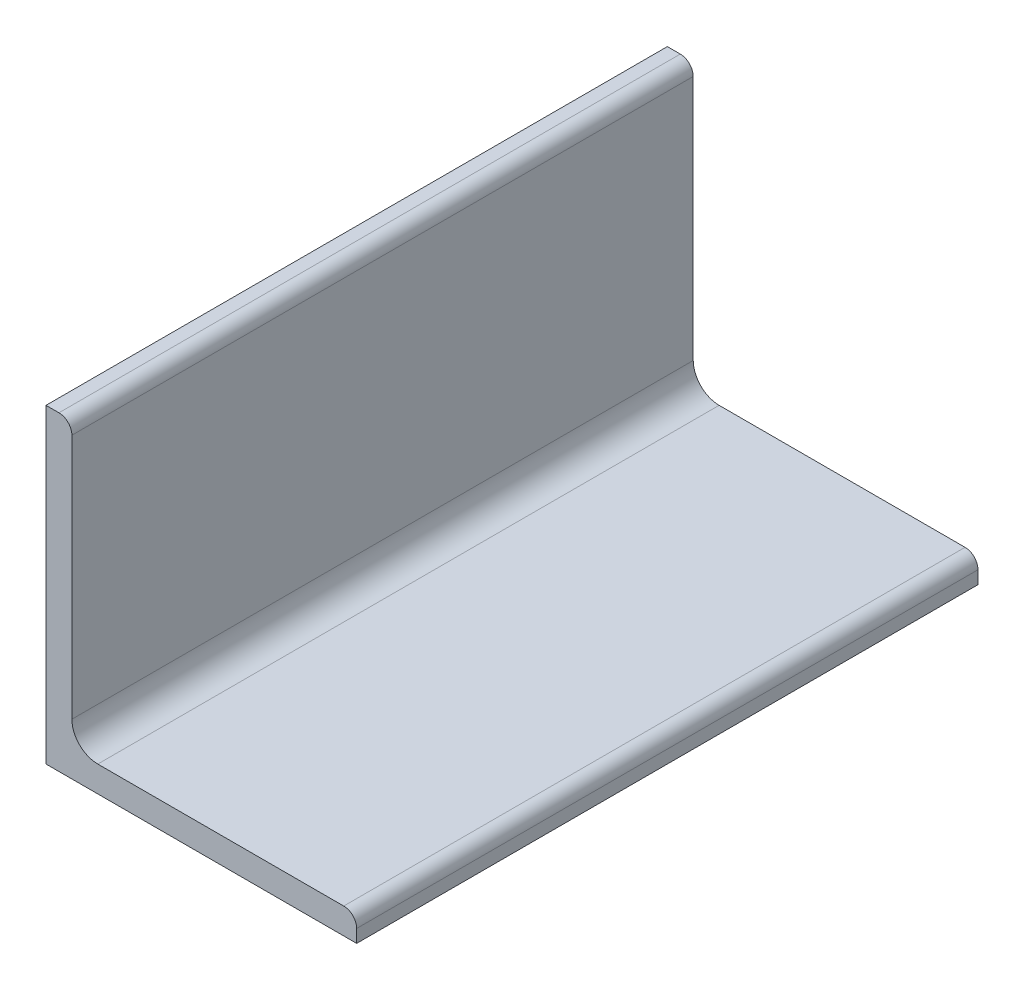
ISO-10303-21;
HEADER;
FILE_DESCRIPTION(('STEP AP214'),'2;1');
FILE_NAME('part.step','',(''),(''),'','','');
FILE_SCHEMA(('AUTOMOTIVE_DESIGN { 1 0 10303 214 1 1 1 1 }'));
ENDSEC;
DATA;
#1=APPLICATION_CONTEXT('core data for automotive mechanical design processes');
#2=APPLICATION_PROTOCOL_DEFINITION('international standard','automotive_design',2000,#1);
#3=PRODUCT_CONTEXT('',#1,'mechanical');
#4=PRODUCT('Part','Part','',(#3));
#5=PRODUCT_RELATED_PRODUCT_CATEGORY('part','',(#4));
#6=PRODUCT_DEFINITION_FORMATION('','',#4);
#7=PRODUCT_DEFINITION_CONTEXT('part definition',#1,'design');
#8=PRODUCT_DEFINITION('design','',#6,#7);
#9=PRODUCT_DEFINITION_SHAPE('','',#8);
#10=(LENGTH_UNIT() NAMED_UNIT(*) SI_UNIT(.MILLI.,.METRE.));
#11=(NAMED_UNIT(*) PLANE_ANGLE_UNIT() SI_UNIT($,.RADIAN.));
#12=(NAMED_UNIT(*) SI_UNIT($,.STERADIAN.) SOLID_ANGLE_UNIT());
#13=UNCERTAINTY_MEASURE_WITH_UNIT(LENGTH_MEASURE(1.E-05),#10,'distance_accuracy_value','');
#14=(GEOMETRIC_REPRESENTATION_CONTEXT(3) GLOBAL_UNCERTAINTY_ASSIGNED_CONTEXT((#13)) GLOBAL_UNIT_ASSIGNED_CONTEXT((#10,
#11,#12)) REPRESENTATION_CONTEXT('',''));
#15=CARTESIAN_POINT('',(0.,0.,0.));
#16=DIRECTION('',(0.,0.,1.));
#17=DIRECTION('',(1.,0.,0.));
#18=AXIS2_PLACEMENT_3D('',#15,#16,#17);
#19=CARTESIAN_POINT('',(0.425014111727251,152.925428131371,304.8));
#20=DIRECTION('',(1.,0.,0.));
#21=DIRECTION('',(0.,0.,-1.));
#22=AXIS2_PLACEMENT_3D('',#19,#20,#21);
#23=PLANE('',#22);
#24=DIRECTION('',(0.,-1.,0.));
#25=VECTOR('',#24,1.);
#26=CARTESIAN_POINT('',(0.425014111727251,152.925428131371,0.));
#27=LINE('',#26,#25);
#28=CARTESIAN_POINT('',(0.425014111727251,152.925428131371,0.));
#29=VERTEX_POINT('',#28);
#30=CARTESIAN_POINT('',(0.425014111727251,0.525428131371291,0.));
#31=VERTEX_POINT('',#30);
#32=EDGE_CURVE('E135',#29,#31,#27,.T.);
#33=ORIENTED_EDGE('',*,*,#32,.T.);
#34=DIRECTION('',(0.,0.,-1.));
#35=VECTOR('',#34,1.);
#36=CARTESIAN_POINT('',(0.425014111727251,0.525428131371291,304.8));
#37=LINE('',#36,#35);
#38=CARTESIAN_POINT('',(0.425014111727251,0.525428131371291,304.8));
#39=VERTEX_POINT('',#38);
#40=EDGE_CURVE('E11',#39,#31,#37,.T.);
#41=ORIENTED_EDGE('',*,*,#40,.F.);
#42=DIRECTION('',(0.,-1.,0.));
#43=VECTOR('',#42,1.);
#44=CARTESIAN_POINT('',(0.425014111727251,152.925428131371,304.8));
#45=LINE('',#44,#43);
#46=CARTESIAN_POINT('',(0.425014111727251,152.925428131371,304.8));
#47=VERTEX_POINT('',#46);
#48=EDGE_CURVE('E151',#47,#39,#45,.T.);
#49=ORIENTED_EDGE('',*,*,#48,.F.);
#50=DIRECTION('',(0.,0.,-1.));
#51=VECTOR('',#50,1.);
#52=CARTESIAN_POINT('',(0.425014111727251,152.925428131371,304.8));
#53=LINE('',#52,#51);
#54=EDGE_CURVE('E131',#47,#29,#53,.T.);
#55=ORIENTED_EDGE('',*,*,#54,.T.);
#56=EDGE_LOOP('',(#33,#41,#49,#55));
#57=FACE_BOUND('',#56,.T.);
#58=ADVANCED_FACE('F33',(#57),#23,.F.);
#59=CARTESIAN_POINT('',(0.425014111727251,0.525428131371291,304.8));
#60=DIRECTION('',(0.,1.,0.));
#61=DIRECTION('',(0.,0.,1.));
#62=AXIS2_PLACEMENT_3D('',#59,#60,#61);
#63=PLANE('',#62);
#64=DIRECTION('',(1.,0.,0.));
#65=VECTOR('',#64,1.);
#66=CARTESIAN_POINT('',(0.425014111727251,0.525428131371291,0.));
#67=LINE('',#66,#65);
#68=CARTESIAN_POINT('',(152.825014111727,0.525428131371291,0.));
#69=VERTEX_POINT('',#68);
#70=EDGE_CURVE('E138',#31,#69,#67,.T.);
#71=ORIENTED_EDGE('',*,*,#70,.T.);
#72=DIRECTION('',(0.,0.,-1.));
#73=VECTOR('',#72,1.);
#74=CARTESIAN_POINT('',(152.825014111727,0.525428131371291,304.8));
#75=LINE('',#74,#73);
#76=CARTESIAN_POINT('',(152.825014111727,0.525428131371291,304.8));
#77=VERTEX_POINT('',#76);
#78=EDGE_CURVE('E41',#77,#69,#75,.T.);
#79=ORIENTED_EDGE('',*,*,#78,.F.);
#80=DIRECTION('',(1.,0.,0.));
#81=VECTOR('',#80,1.);
#82=CARTESIAN_POINT('',(0.425014111727251,0.525428131371291,304.8));
#83=LINE('',#82,#81);
#84=EDGE_CURVE('E95',#39,#77,#83,.T.);
#85=ORIENTED_EDGE('',*,*,#84,.F.);
#86=ORIENTED_EDGE('',*,*,#40,.T.);
#87=EDGE_LOOP('',(#71,#79,#85,#86));
#88=FACE_BOUND('',#87,.T.);
#89=ADVANCED_FACE('F194',(#88),#63,.F.);
#90=CARTESIAN_POINT('',(152.825014111727,0.525428131371291,304.8));
#91=DIRECTION('',(-1.,0.,0.));
#92=DIRECTION('',(0.,0.,1.));
#93=AXIS2_PLACEMENT_3D('',#90,#91,#92);
#94=PLANE('',#93);
#95=DIRECTION('',(0.,1.,0.));
#96=VECTOR('',#95,1.);
#97=CARTESIAN_POINT('',(152.825014111727,0.525428131371291,0.));
#98=LINE('',#97,#96);
#99=CARTESIAN_POINT('',(152.825014111727,6.87542813137129,0.));
#100=VERTEX_POINT('',#99);
#101=EDGE_CURVE('E140',#69,#100,#98,.T.);
#102=ORIENTED_EDGE('',*,*,#101,.T.);
#103=DIRECTION('',(0.,0.,-1.));
#104=VECTOR('',#103,1.);
#105=CARTESIAN_POINT('',(152.825014111727,6.87542813137129,304.8));
#106=LINE('',#105,#104);
#107=CARTESIAN_POINT('',(152.825014111727,6.87542813137129,304.8));
#108=VERTEX_POINT('',#107);
#109=EDGE_CURVE('E161',#108,#100,#106,.T.);
#110=ORIENTED_EDGE('',*,*,#109,.F.);
#111=DIRECTION('',(0.,1.,0.));
#112=VECTOR('',#111,1.);
#113=CARTESIAN_POINT('',(152.825014111727,0.525428131371291,304.8));
#114=LINE('',#113,#112);
#115=EDGE_CURVE('E169',#77,#108,#114,.T.);
#116=ORIENTED_EDGE('',*,*,#115,.F.);
#117=ORIENTED_EDGE('',*,*,#78,.T.);
#118=EDGE_LOOP('',(#102,#110,#116,#117));
#119=FACE_BOUND('',#118,.T.);
#120=ADVANCED_FACE('F167',(#119),#94,.F.);
#121=CARTESIAN_POINT('',(146.475014111727,6.87542813137129,304.8));
#122=DIRECTION('',(0.,0.,-1.));
#123=DIRECTION('',(-1.,0.,0.));
#124=AXIS2_PLACEMENT_3D('',#121,#122,#123);
#125=CYLINDRICAL_SURFACE('',#124,6.35);
#126=CARTESIAN_POINT('',(146.475014111727,6.87542813137129,0.));
#127=DIRECTION('',(0.,0.,1.));
#128=DIRECTION('',(1.,0.,0.));
#129=AXIS2_PLACEMENT_3D('',#126,#127,#128);
#130=CIRCLE('',#129,6.35);
#131=CARTESIAN_POINT('',(146.475014111727,13.2254281313713,0.));
#132=VERTEX_POINT('',#131);
#133=EDGE_CURVE('E142',#100,#132,#130,.T.);
#134=ORIENTED_EDGE('',*,*,#133,.T.);
#135=DIRECTION('',(0.,0.,-1.));
#136=VECTOR('',#135,1.);
#137=CARTESIAN_POINT('',(146.475014111727,13.2254281313713,304.8));
#138=LINE('',#137,#136);
#139=CARTESIAN_POINT('',(146.475014111727,13.2254281313713,304.8));
#140=VERTEX_POINT('',#139);
#141=EDGE_CURVE('E158',#140,#132,#138,.T.);
#142=ORIENTED_EDGE('',*,*,#141,.F.);
#143=CARTESIAN_POINT('',(146.475014111727,6.87542813137129,304.8));
#144=DIRECTION('',(0.,0.,1.));
#145=DIRECTION('',(1.,0.,0.));
#146=AXIS2_PLACEMENT_3D('',#143,#144,#145);
#147=CIRCLE('',#146,6.35);
#148=EDGE_CURVE('E185',#108,#140,#147,.T.);
#149=ORIENTED_EDGE('',*,*,#148,.F.);
#150=ORIENTED_EDGE('',*,*,#109,.T.);
#151=EDGE_LOOP('',(#134,#142,#149,#150));
#152=FACE_BOUND('',#151,.T.);
#153=ADVANCED_FACE('F178',(#152),#125,.T.);
#154=CARTESIAN_POINT('',(146.475014111727,13.2254281313713,304.8));
#155=DIRECTION('',(0.,-1.,0.));
#156=DIRECTION('',(0.,0.,-1.));
#157=AXIS2_PLACEMENT_3D('',#154,#155,#156);
#158=PLANE('',#157);
#159=DIRECTION('',(-1.,0.,0.));
#160=VECTOR('',#159,1.);
#161=CARTESIAN_POINT('',(146.475014111727,13.2254281313713,0.));
#162=LINE('',#161,#160);
#163=CARTESIAN_POINT('',(25.8250141117272,13.2254281313713,0.));
#164=VERTEX_POINT('',#163);
#165=EDGE_CURVE('E144',#132,#164,#162,.T.);
#166=ORIENTED_EDGE('',*,*,#165,.T.);
#167=DIRECTION('',(0.,0.,-1.));
#168=VECTOR('',#167,1.);
#169=CARTESIAN_POINT('',(25.8250141117272,13.2254281313713,304.8));
#170=LINE('',#169,#168);
#171=CARTESIAN_POINT('',(25.8250141117272,13.2254281313713,304.8));
#172=VERTEX_POINT('',#171);
#173=EDGE_CURVE('E155',#172,#164,#170,.T.);
#174=ORIENTED_EDGE('',*,*,#173,.F.);
#175=DIRECTION('',(-1.,0.,0.));
#176=VECTOR('',#175,1.);
#177=CARTESIAN_POINT('',(146.475014111727,13.2254281313713,304.8));
#178=LINE('',#177,#176);
#179=EDGE_CURVE('E184',#140,#172,#178,.T.);
#180=ORIENTED_EDGE('',*,*,#179,.F.);
#181=ORIENTED_EDGE('',*,*,#141,.T.);
#182=EDGE_LOOP('',(#166,#174,#180,#181));
#183=FACE_BOUND('',#182,.T.);
#184=ADVANCED_FACE('F182',(#183),#158,.F.);
#185=CARTESIAN_POINT('',(25.8250141117272,25.9254281313713,304.8));
#186=DIRECTION('',(0.,0.,-1.));
#187=DIRECTION('',(-1.,0.,0.));
#188=AXIS2_PLACEMENT_3D('',#185,#186,#187);
#189=CYLINDRICAL_SURFACE('',#188,12.7);
#190=CARTESIAN_POINT('',(25.8250141117272,25.9254281313713,0.));
#191=DIRECTION('',(0.,0.,-1.));
#192=DIRECTION('',(1.,0.,0.));
#193=AXIS2_PLACEMENT_3D('',#190,#191,#192);
#194=CIRCLE('',#193,12.7);
#195=CARTESIAN_POINT('',(13.1250141117273,25.9254281313713,0.));
#196=VERTEX_POINT('',#195);
#197=EDGE_CURVE('E146',#164,#196,#194,.T.);
#198=ORIENTED_EDGE('',*,*,#197,.T.);
#199=DIRECTION('',(0.,0.,-1.));
#200=VECTOR('',#199,1.);
#201=CARTESIAN_POINT('',(13.1250141117273,25.9254281313713,304.8));
#202=LINE('',#201,#200);
#203=CARTESIAN_POINT('',(13.1250141117273,25.9254281313713,304.8));
#204=VERTEX_POINT('',#203);
#205=EDGE_CURVE('E126',#204,#196,#202,.T.);
#206=ORIENTED_EDGE('',*,*,#205,.F.);
#207=CARTESIAN_POINT('',(25.8250141117272,25.9254281313713,304.8));
#208=DIRECTION('',(0.,0.,-1.));
#209=DIRECTION('',(1.,0.,0.));
#210=AXIS2_PLACEMENT_3D('',#207,#208,#209);
#211=CIRCLE('',#210,12.7);
#212=EDGE_CURVE('E117',#172,#204,#211,.T.);
#213=ORIENTED_EDGE('',*,*,#212,.F.);
#214=ORIENTED_EDGE('',*,*,#173,.T.);
#215=EDGE_LOOP('',(#198,#206,#213,#214));
#216=FACE_BOUND('',#215,.T.);
#217=ADVANCED_FACE('F206',(#216),#189,.F.);
#218=CARTESIAN_POINT('',(13.1250141117273,25.9254281313713,304.8));
#219=DIRECTION('',(-1.,0.,0.));
#220=DIRECTION('',(0.,0.,1.));
#221=AXIS2_PLACEMENT_3D('',#218,#219,#220);
#222=PLANE('',#221);
#223=DIRECTION('',(0.,1.,0.));
#224=VECTOR('',#223,1.);
#225=CARTESIAN_POINT('',(13.1250141117273,25.9254281313713,0.));
#226=LINE('',#225,#224);
#227=CARTESIAN_POINT('',(13.1250141117273,146.575428131371,0.));
#228=VERTEX_POINT('',#227);
#229=EDGE_CURVE('E125',#196,#228,#226,.T.);
#230=ORIENTED_EDGE('',*,*,#229,.T.);
#231=DIRECTION('',(0.,0.,-1.));
#232=VECTOR('',#231,1.);
#233=CARTESIAN_POINT('',(13.1250141117273,146.575428131371,304.8));
#234=LINE('',#233,#232);
#235=CARTESIAN_POINT('',(13.1250141117273,146.575428131371,304.8));
#236=VERTEX_POINT('',#235);
#237=EDGE_CURVE('E122',#236,#228,#234,.T.);
#238=ORIENTED_EDGE('',*,*,#237,.F.);
#239=DIRECTION('',(0.,1.,0.));
#240=VECTOR('',#239,1.);
#241=CARTESIAN_POINT('',(13.1250141117273,25.9254281313713,304.8));
#242=LINE('',#241,#240);
#243=EDGE_CURVE('E111',#204,#236,#242,.T.);
#244=ORIENTED_EDGE('',*,*,#243,.F.);
#245=ORIENTED_EDGE('',*,*,#205,.T.);
#246=EDGE_LOOP('',(#230,#238,#244,#245));
#247=FACE_BOUND('',#246,.T.);
#248=ADVANCED_FACE('F123',(#247),#222,.F.);
#249=CARTESIAN_POINT('',(6.77501411172725,146.575428131371,304.8));
#250=DIRECTION('',(0.,0.,-1.));
#251=DIRECTION('',(-1.,0.,0.));
#252=AXIS2_PLACEMENT_3D('',#249,#250,#251);
#253=CYLINDRICAL_SURFACE('',#252,6.35);
#254=CARTESIAN_POINT('',(6.77501411172725,146.575428131371,0.));
#255=DIRECTION('',(0.,0.,1.));
#256=DIRECTION('',(1.,0.,0.));
#257=AXIS2_PLACEMENT_3D('',#254,#255,#256);
#258=CIRCLE('',#257,6.35);
#259=CARTESIAN_POINT('',(6.77501411172725,152.925428131371,0.));
#260=VERTEX_POINT('',#259);
#261=EDGE_CURVE('E81',#228,#260,#258,.T.);
#262=ORIENTED_EDGE('',*,*,#261,.T.);
#263=DIRECTION('',(0.,0.,-1.));
#264=VECTOR('',#263,1.);
#265=CARTESIAN_POINT('',(6.77501411172725,152.925428131371,304.8));
#266=LINE('',#265,#264);
#267=CARTESIAN_POINT('',(6.77501411172725,152.925428131371,304.8));
#268=VERTEX_POINT('',#267);
#269=EDGE_CURVE('E127',#268,#260,#266,.T.);
#270=ORIENTED_EDGE('',*,*,#269,.F.);
#271=CARTESIAN_POINT('',(6.77501411172725,146.575428131371,304.8));
#272=DIRECTION('',(0.,0.,1.));
#273=DIRECTION('',(1.,0.,0.));
#274=AXIS2_PLACEMENT_3D('',#271,#272,#273);
#275=CIRCLE('',#274,6.35);
#276=EDGE_CURVE('E115',#236,#268,#275,.T.);
#277=ORIENTED_EDGE('',*,*,#276,.F.);
#278=ORIENTED_EDGE('',*,*,#237,.T.);
#279=EDGE_LOOP('',(#262,#270,#277,#278));
#280=FACE_BOUND('',#279,.T.);
#281=ADVANCED_FACE('F129',(#280),#253,.T.);
#282=CARTESIAN_POINT('',(6.77501411172725,152.925428131371,304.8));
#283=DIRECTION('',(0.,-1.,0.));
#284=DIRECTION('',(0.,0.,-1.));
#285=AXIS2_PLACEMENT_3D('',#282,#283,#284);
#286=PLANE('',#285);
#287=DIRECTION('',(-1.,0.,0.));
#288=VECTOR('',#287,1.);
#289=CARTESIAN_POINT('',(6.77501411172725,152.925428131371,0.));
#290=LINE('',#289,#288);
#291=EDGE_CURVE('E87',#260,#29,#290,.T.);
#292=ORIENTED_EDGE('',*,*,#291,.T.);
#293=ORIENTED_EDGE('',*,*,#54,.F.);
#294=DIRECTION('',(-1.,0.,0.));
#295=VECTOR('',#294,1.);
#296=CARTESIAN_POINT('',(6.77501411172725,152.925428131371,304.8));
#297=LINE('',#296,#295);
#298=EDGE_CURVE('E49',#268,#47,#297,.T.);
#299=ORIENTED_EDGE('',*,*,#298,.F.);
#300=ORIENTED_EDGE('',*,*,#269,.T.);
#301=EDGE_LOOP('',(#292,#293,#299,#300));
#302=FACE_BOUND('',#301,.T.);
#303=ADVANCED_FACE('F214',(#302),#286,.F.);
#304=CARTESIAN_POINT('',(146.475014111727,6.87542813137129,304.8));
#305=DIRECTION('',(0.,0.,1.));
#306=DIRECTION('',(1.,0.,0.));
#307=AXIS2_PLACEMENT_3D('',#304,#305,#306);
#308=PLANE('',#307);
#309=ORIENTED_EDGE('',*,*,#48,.T.);
#310=ORIENTED_EDGE('',*,*,#84,.T.);
#311=ORIENTED_EDGE('',*,*,#115,.T.);
#312=ORIENTED_EDGE('',*,*,#148,.T.);
#313=ORIENTED_EDGE('',*,*,#179,.T.);
#314=ORIENTED_EDGE('',*,*,#212,.T.);
#315=ORIENTED_EDGE('',*,*,#243,.T.);
#316=ORIENTED_EDGE('',*,*,#276,.T.);
#317=ORIENTED_EDGE('',*,*,#298,.T.);
#318=EDGE_LOOP('',(#309,#310,#311,#312,#313,#314,#315,#316,#317));
#319=FACE_BOUND('',#318,.T.);
#320=ADVANCED_FACE('F113',(#319),#308,.T.);
#321=CARTESIAN_POINT('',(146.475014111727,6.87542813137129,0.));
#322=DIRECTION('',(0.,0.,1.));
#323=DIRECTION('',(1.,0.,0.));
#324=AXIS2_PLACEMENT_3D('',#321,#322,#323);
#325=PLANE('',#324);
#326=ORIENTED_EDGE('',*,*,#32,.F.);
#327=ORIENTED_EDGE('',*,*,#291,.F.);
#328=ORIENTED_EDGE('',*,*,#261,.F.);
#329=ORIENTED_EDGE('',*,*,#229,.F.);
#330=ORIENTED_EDGE('',*,*,#197,.F.);
#331=ORIENTED_EDGE('',*,*,#165,.F.);
#332=ORIENTED_EDGE('',*,*,#133,.F.);
#333=ORIENTED_EDGE('',*,*,#101,.F.);
#334=ORIENTED_EDGE('',*,*,#70,.F.);
#335=EDGE_LOOP('',(#326,#327,#328,#329,#330,#331,#332,#333,#334));
#336=FACE_BOUND('',#335,.T.);
#337=ADVANCED_FACE('F173',(#336),#325,.F.);
#338=CLOSED_SHELL('',(#58,#89,#120,#153,#184,#217,#248,#281,#303,#320,#337));
#339=MANIFOLD_SOLID_BREP('B2',#338);
#340=ADVANCED_BREP_SHAPE_REPRESENTATION('',(#18,#339),#14);
#341=SHAPE_DEFINITION_REPRESENTATION(#9,#340);
ENDSEC;
END-ISO-10303-21;
